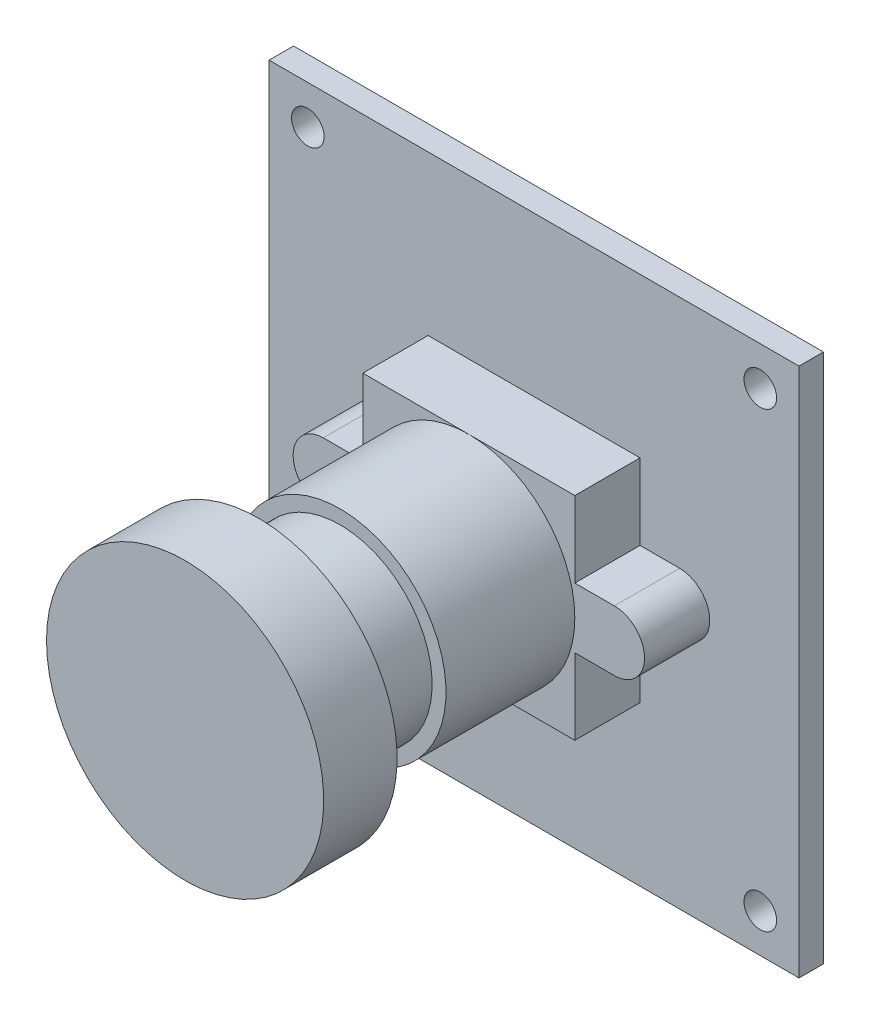
ISO-10303-21;
HEADER;
FILE_DESCRIPTION(('STEP AP214'),'2;1');
FILE_NAME('part.step','',(''),(''),'','','');
FILE_SCHEMA(('AUTOMOTIVE_DESIGN { 1 0 10303 214 1 1 1 1 }'));
ENDSEC;
DATA;
#1=APPLICATION_CONTEXT('core data for automotive mechanical design processes');
#2=APPLICATION_PROTOCOL_DEFINITION('international standard','automotive_design',2000,#1);
#3=PRODUCT_CONTEXT('',#1,'mechanical');
#4=PRODUCT('Part','Part','',(#3));
#5=PRODUCT_RELATED_PRODUCT_CATEGORY('part','',(#4));
#6=PRODUCT_DEFINITION_FORMATION('','',#4);
#7=PRODUCT_DEFINITION_CONTEXT('part definition',#1,'design');
#8=PRODUCT_DEFINITION('design','',#6,#7);
#9=PRODUCT_DEFINITION_SHAPE('','',#8);
#10=(LENGTH_UNIT() NAMED_UNIT(*) SI_UNIT(.MILLI.,.METRE.));
#11=(NAMED_UNIT(*) PLANE_ANGLE_UNIT() SI_UNIT($,.RADIAN.));
#12=(NAMED_UNIT(*) SI_UNIT($,.STERADIAN.) SOLID_ANGLE_UNIT());
#13=UNCERTAINTY_MEASURE_WITH_UNIT(LENGTH_MEASURE(1.E-05),#10,'distance_accuracy_value','');
#14=(GEOMETRIC_REPRESENTATION_CONTEXT(3) GLOBAL_UNCERTAINTY_ASSIGNED_CONTEXT((#13)) GLOBAL_UNIT_ASSIGNED_CONTEXT((#10,
#11,#12)) REPRESENTATION_CONTEXT('',''));
#15=CARTESIAN_POINT('',(0.,0.,0.));
#16=DIRECTION('',(0.,0.,1.));
#17=DIRECTION('',(1.,0.,0.));
#18=AXIS2_PLACEMENT_3D('',#15,#16,#17);
#19=CARTESIAN_POINT('',(0.,0.,0.));
#20=DIRECTION('',(0.,0.,1.));
#21=DIRECTION('',(1.,0.,0.));
#22=AXIS2_PLACEMENT_3D('',#19,#20,#21);
#23=PLANE('',#22);
#24=CARTESIAN_POINT('',(-13.875,13.875,0.));
#25=DIRECTION('',(0.,0.,1.));
#26=DIRECTION('',(1.,0.,0.));
#27=AXIS2_PLACEMENT_3D('',#24,#25,#26);
#28=CIRCLE('',#27,1.);
#29=CARTESIAN_POINT('',(-12.875,13.875,0.));
#30=VERTEX_POINT('',#29);
#31=EDGE_CURVE('E382',#30,#30,#28,.T.);
#32=ORIENTED_EDGE('',*,*,#31,.T.);
#33=EDGE_LOOP('',(#32));
#34=FACE_BOUND('',#33,.T.);
#35=CARTESIAN_POINT('',(-13.875,-13.875,0.));
#36=DIRECTION('',(0.,0.,1.));
#37=DIRECTION('',(1.,0.,0.));
#38=AXIS2_PLACEMENT_3D('',#35,#36,#37);
#39=CIRCLE('',#38,1.);
#40=CARTESIAN_POINT('',(-12.875,-13.875,0.));
#41=VERTEX_POINT('',#40);
#42=EDGE_CURVE('E387',#41,#41,#39,.T.);
#43=ORIENTED_EDGE('',*,*,#42,.T.);
#44=EDGE_LOOP('',(#43));
#45=FACE_BOUND('',#44,.T.);
#46=CARTESIAN_POINT('',(13.875,-13.875,0.));
#47=DIRECTION('',(0.,0.,1.));
#48=DIRECTION('',(1.,0.,0.));
#49=AXIS2_PLACEMENT_3D('',#46,#47,#48);
#50=CIRCLE('',#49,1.);
#51=CARTESIAN_POINT('',(14.875,-13.875,0.));
#52=VERTEX_POINT('',#51);
#53=EDGE_CURVE('E395',#52,#52,#50,.T.);
#54=ORIENTED_EDGE('',*,*,#53,.T.);
#55=EDGE_LOOP('',(#54));
#56=FACE_BOUND('',#55,.T.);
#57=CARTESIAN_POINT('',(13.875,13.875,0.));
#58=DIRECTION('',(0.,0.,1.));
#59=DIRECTION('',(1.,0.,0.));
#60=AXIS2_PLACEMENT_3D('',#57,#58,#59);
#61=CIRCLE('',#60,1.);
#62=CARTESIAN_POINT('',(14.875,13.875,0.));
#63=VERTEX_POINT('',#62);
#64=EDGE_CURVE('E403',#63,#63,#61,.T.);
#65=ORIENTED_EDGE('',*,*,#64,.T.);
#66=EDGE_LOOP('',(#65));
#67=FACE_BOUND('',#66,.T.);
#68=DIRECTION('',(0.,-1.,0.));
#69=VECTOR('',#68,1.);
#70=CARTESIAN_POINT('',(5.,-16.25,0.));
#71=LINE('',#70,#69);
#72=CARTESIAN_POINT('',(5.,-11.5,0.));
#73=VERTEX_POINT('',#72);
#74=CARTESIAN_POINT('',(5.,-16.25,0.));
#75=VERTEX_POINT('',#74);
#76=EDGE_CURVE('E87',#73,#75,#71,.T.);
#77=ORIENTED_EDGE('',*,*,#76,.F.);
#78=DIRECTION('',(1.,0.,0.));
#79=VECTOR('',#78,1.);
#80=CARTESIAN_POINT('',(-5.,-11.5,0.));
#81=LINE('',#80,#79);
#82=CARTESIAN_POINT('',(-5.,-11.5,0.));
#83=VERTEX_POINT('',#82);
#84=EDGE_CURVE('E235',#83,#73,#81,.T.);
#85=ORIENTED_EDGE('',*,*,#84,.F.);
#86=DIRECTION('',(0.,1.,0.));
#87=VECTOR('',#86,1.);
#88=CARTESIAN_POINT('',(-5.,-16.25,0.));
#89=LINE('',#88,#87);
#90=CARTESIAN_POINT('',(-5.,-16.25,0.));
#91=VERTEX_POINT('',#90);
#92=EDGE_CURVE('E462',#91,#83,#89,.T.);
#93=ORIENTED_EDGE('',*,*,#92,.F.);
#94=DIRECTION('',(1.,0.,0.));
#95=VECTOR('',#94,1.);
#96=CARTESIAN_POINT('',(16.25,-16.25,0.));
#97=LINE('',#96,#95);
#98=CARTESIAN_POINT('',(-16.25,-16.25,0.));
#99=VERTEX_POINT('',#98);
#100=EDGE_CURVE('E433',#99,#91,#97,.T.);
#101=ORIENTED_EDGE('',*,*,#100,.F.);
#102=DIRECTION('',(0.,-1.,0.));
#103=VECTOR('',#102,1.);
#104=CARTESIAN_POINT('',(-16.25,-16.25,0.));
#105=LINE('',#104,#103);
#106=CARTESIAN_POINT('',(-16.25,16.25,0.));
#107=VERTEX_POINT('',#106);
#108=EDGE_CURVE('E411',#107,#99,#105,.T.);
#109=ORIENTED_EDGE('',*,*,#108,.F.);
#110=DIRECTION('',(-1.,0.,0.));
#111=VECTOR('',#110,1.);
#112=CARTESIAN_POINT('',(16.25,16.25,0.));
#113=LINE('',#112,#111);
#114=CARTESIAN_POINT('',(16.25,16.25,0.));
#115=VERTEX_POINT('',#114);
#116=EDGE_CURVE('E420',#115,#107,#113,.T.);
#117=ORIENTED_EDGE('',*,*,#116,.F.);
#118=DIRECTION('',(0.,1.,0.));
#119=VECTOR('',#118,1.);
#120=CARTESIAN_POINT('',(16.25,-16.25,0.));
#121=LINE('',#120,#119);
#122=CARTESIAN_POINT('',(16.25,-16.25,0.));
#123=VERTEX_POINT('',#122);
#124=EDGE_CURVE('E436',#123,#115,#121,.T.);
#125=ORIENTED_EDGE('',*,*,#124,.F.);
#126=EDGE_CURVE('E92',#75,#123,#97,.T.);
#127=ORIENTED_EDGE('',*,*,#126,.F.);
#128=EDGE_LOOP('',(#77,#85,#93,#101,#109,#117,#125,#127));
#129=FACE_BOUND('',#128,.T.);
#130=ADVANCED_FACE('F69',(#34,#45,#56,#67,#129),#23,.F.);
#131=CARTESIAN_POINT('',(0.,0.,5.5));
#132=DIRECTION('',(0.,0.,-1.));
#133=DIRECTION('',(-1.,0.,0.));
#134=AXIS2_PLACEMENT_3D('',#131,#132,#133);
#135=PLANE('',#134);
#136=DIRECTION('',(-1.,0.,0.));
#137=VECTOR('',#136,1.);
#138=CARTESIAN_POINT('',(6.5,6.5,5.5));
#139=LINE('',#138,#137);
#140=CARTESIAN_POINT('',(6.5,6.5,5.5));
#141=VERTEX_POINT('',#140);
#142=CARTESIAN_POINT('',(0.,6.5,5.5));
#143=VERTEX_POINT('',#142);
#144=EDGE_CURVE('E268',#141,#143,#139,.T.);
#145=ORIENTED_EDGE('',*,*,#144,.T.);
#146=CARTESIAN_POINT('',(0.,0.,5.5));
#147=DIRECTION('',(0.,0.,-1.));
#148=DIRECTION('',(-1.,0.,0.));
#149=AXIS2_PLACEMENT_3D('',#146,#147,#148);
#150=CIRCLE('',#149,6.5);
#151=CARTESIAN_POINT('',(0.,-6.5,5.5));
#152=VERTEX_POINT('',#151);
#153=EDGE_CURVE('E80',#143,#152,#150,.T.);
#154=ORIENTED_EDGE('',*,*,#153,.T.);
#155=DIRECTION('',(-1.,0.,0.));
#156=VECTOR('',#155,1.);
#157=CARTESIAN_POINT('',(6.5,-6.5,5.5));
#158=LINE('',#157,#156);
#159=CARTESIAN_POINT('',(6.5,-6.5,5.5));
#160=VERTEX_POINT('',#159);
#161=EDGE_CURVE('E279',#160,#152,#158,.T.);
#162=ORIENTED_EDGE('',*,*,#161,.F.);
#163=DIRECTION('',(0.,1.,0.));
#164=VECTOR('',#163,1.);
#165=CARTESIAN_POINT('',(6.5,-6.5,5.5));
#166=LINE('',#165,#164);
#167=CARTESIAN_POINT('',(6.5,-1.85,5.5));
#168=VERTEX_POINT('',#167);
#169=EDGE_CURVE('E284',#160,#168,#166,.T.);
#170=ORIENTED_EDGE('',*,*,#169,.T.);
#171=DIRECTION('',(-1.,0.,0.));
#172=VECTOR('',#171,1.);
#173=CARTESIAN_POINT('',(8.925,-1.84999999999999,5.5));
#174=LINE('',#173,#172);
#175=CARTESIAN_POINT('',(8.925,-1.84999999999999,5.5));
#176=VERTEX_POINT('',#175);
#177=EDGE_CURVE('E337',#176,#168,#174,.T.);
#178=ORIENTED_EDGE('',*,*,#177,.F.);
#179=CARTESIAN_POINT('',(8.925,0.,5.5));
#180=DIRECTION('',(0.,0.,1.));
#181=DIRECTION('',(1.,0.,0.));
#182=AXIS2_PLACEMENT_3D('',#179,#180,#181);
#183=CIRCLE('',#182,1.85);
#184=CARTESIAN_POINT('',(8.925,1.85000000000001,5.5));
#185=VERTEX_POINT('',#184);
#186=EDGE_CURVE('E322',#176,#185,#183,.T.);
#187=ORIENTED_EDGE('',*,*,#186,.T.);
#188=DIRECTION('',(-1.,0.,0.));
#189=VECTOR('',#188,1.);
#190=CARTESIAN_POINT('',(8.925,1.85000000000001,5.5));
#191=LINE('',#190,#189);
#192=CARTESIAN_POINT('',(6.5,1.85,5.5));
#193=VERTEX_POINT('',#192);
#194=EDGE_CURVE('E328',#185,#193,#191,.T.);
#195=ORIENTED_EDGE('',*,*,#194,.T.);
#196=EDGE_CURVE('E283',#193,#141,#166,.T.);
#197=ORIENTED_EDGE('',*,*,#196,.T.);
#198=EDGE_LOOP('',(#145,#154,#162,#170,#178,#187,#195,#197));
#199=FACE_BOUND('',#198,.T.);
#200=ADVANCED_FACE('F493',(#199),#135,.F.);
#201=CARTESIAN_POINT('',(0.,0.,1.5));
#202=DIRECTION('',(0.,0.,1.));
#203=DIRECTION('',(1.,0.,0.));
#204=AXIS2_PLACEMENT_3D('',#201,#202,#203);
#205=PLANE('',#204);
#206=DIRECTION('',(-1.,0.,0.));
#207=VECTOR('',#206,1.);
#208=CARTESIAN_POINT('',(8.925,-1.84999999999999,1.5));
#209=LINE('',#208,#207);
#210=CARTESIAN_POINT('',(8.925,-1.85,1.5));
#211=VERTEX_POINT('',#210);
#212=CARTESIAN_POINT('',(6.5,-1.85,1.5));
#213=VERTEX_POINT('',#212);
#214=EDGE_CURVE('E327',#211,#213,#209,.T.);
#215=ORIENTED_EDGE('',*,*,#214,.T.);
#216=DIRECTION('',(0.,1.,0.));
#217=VECTOR('',#216,1.);
#218=CARTESIAN_POINT('',(6.5,-6.5,1.5));
#219=LINE('',#218,#217);
#220=CARTESIAN_POINT('',(6.5,-6.5,1.5));
#221=VERTEX_POINT('',#220);
#222=EDGE_CURVE('E302',#221,#213,#219,.T.);
#223=ORIENTED_EDGE('',*,*,#222,.F.);
#224=DIRECTION('',(-1.,0.,0.));
#225=VECTOR('',#224,1.);
#226=CARTESIAN_POINT('',(6.5,-6.5,1.5));
#227=LINE('',#226,#225);
#228=CARTESIAN_POINT('',(-6.5,-6.5,1.5));
#229=VERTEX_POINT('',#228);
#230=EDGE_CURVE('E298',#221,#229,#227,.T.);
#231=ORIENTED_EDGE('',*,*,#230,.T.);
#232=DIRECTION('',(0.,1.,0.));
#233=VECTOR('',#232,1.);
#234=CARTESIAN_POINT('',(-6.5,-6.5,1.5));
#235=LINE('',#234,#233);
#236=CARTESIAN_POINT('',(-6.5,-1.85,1.5));
#237=VERTEX_POINT('',#236);
#238=EDGE_CURVE('E295',#229,#237,#235,.T.);
#239=ORIENTED_EDGE('',*,*,#238,.T.);
#240=CARTESIAN_POINT('',(-8.925,-1.85,1.5));
#241=VERTEX_POINT('',#240);
#242=EDGE_CURVE('E354',#237,#241,#209,.T.);
#243=ORIENTED_EDGE('',*,*,#242,.T.);
#244=CARTESIAN_POINT('',(-8.925,0.,1.5));
#245=DIRECTION('',(0.,0.,1.));
#246=DIRECTION('',(1.,0.,0.));
#247=AXIS2_PLACEMENT_3D('',#244,#245,#246);
#248=CIRCLE('',#247,1.85);
#249=CARTESIAN_POINT('',(-8.925,1.85,1.5));
#250=VERTEX_POINT('',#249);
#251=EDGE_CURVE('E350',#250,#241,#248,.T.);
#252=ORIENTED_EDGE('',*,*,#251,.F.);
#253=DIRECTION('',(-1.,0.,0.));
#254=VECTOR('',#253,1.);
#255=CARTESIAN_POINT('',(8.925,1.85000000000001,1.5));
#256=LINE('',#255,#254);
#257=CARTESIAN_POINT('',(-6.5,1.85,1.5));
#258=VERTEX_POINT('',#257);
#259=EDGE_CURVE('E345',#258,#250,#256,.T.);
#260=ORIENTED_EDGE('',*,*,#259,.F.);
#261=CARTESIAN_POINT('',(-6.5,6.5,1.5));
#262=VERTEX_POINT('',#261);
#263=EDGE_CURVE('E293',#258,#262,#235,.T.);
#264=ORIENTED_EDGE('',*,*,#263,.T.);
#265=DIRECTION('',(-1.,0.,0.));
#266=VECTOR('',#265,1.);
#267=CARTESIAN_POINT('',(6.5,6.5,1.5));
#268=LINE('',#267,#266);
#269=CARTESIAN_POINT('',(6.5,6.5,1.5));
#270=VERTEX_POINT('',#269);
#271=EDGE_CURVE('E289',#270,#262,#268,.T.);
#272=ORIENTED_EDGE('',*,*,#271,.F.);
#273=CARTESIAN_POINT('',(6.5,1.85,1.5));
#274=VERTEX_POINT('',#273);
#275=EDGE_CURVE('E301',#274,#270,#219,.T.);
#276=ORIENTED_EDGE('',*,*,#275,.F.);
#277=CARTESIAN_POINT('',(8.925,1.85000000000001,1.5));
#278=VERTEX_POINT('',#277);
#279=EDGE_CURVE('E346',#278,#274,#256,.T.);
#280=ORIENTED_EDGE('',*,*,#279,.F.);
#281=CARTESIAN_POINT('',(8.925,0.,1.5));
#282=DIRECTION('',(0.,0.,1.));
#283=DIRECTION('',(1.,0.,0.));
#284=AXIS2_PLACEMENT_3D('',#281,#282,#283);
#285=CIRCLE('',#284,1.85);
#286=EDGE_CURVE('E267',#211,#278,#285,.T.);
#287=ORIENTED_EDGE('',*,*,#286,.F.);
#288=EDGE_LOOP('',(#215,#223,#231,#239,#243,#252,#260,#264,#272,#276,#280,#287));
#289=FACE_BOUND('',#288,.T.);
#290=CARTESIAN_POINT('',(-13.875,-13.875,1.5));
#291=DIRECTION('',(0.,0.,1.));
#292=DIRECTION('',(1.,0.,0.));
#293=AXIS2_PLACEMENT_3D('',#290,#291,#292);
#294=CIRCLE('',#293,1.);
#295=CARTESIAN_POINT('',(-12.875,-13.875,1.5));
#296=VERTEX_POINT('',#295);
#297=EDGE_CURVE('E391',#296,#296,#294,.T.);
#298=ORIENTED_EDGE('',*,*,#297,.F.);
#299=EDGE_LOOP('',(#298));
#300=FACE_BOUND('',#299,.T.);
#301=CARTESIAN_POINT('',(13.875,13.875,1.5));
#302=DIRECTION('',(0.,0.,1.));
#303=DIRECTION('',(1.,0.,0.));
#304=AXIS2_PLACEMENT_3D('',#301,#302,#303);
#305=CIRCLE('',#304,1.);
#306=CARTESIAN_POINT('',(14.875,13.875,1.5));
#307=VERTEX_POINT('',#306);
#308=EDGE_CURVE('E407',#307,#307,#305,.T.);
#309=ORIENTED_EDGE('',*,*,#308,.F.);
#310=EDGE_LOOP('',(#309));
#311=FACE_BOUND('',#310,.T.);
#312=DIRECTION('',(0.,-1.,0.));
#313=VECTOR('',#312,1.);
#314=CARTESIAN_POINT('',(-16.25,-16.25,1.5));
#315=LINE('',#314,#313);
#316=CARTESIAN_POINT('',(-16.25,16.25,1.5));
#317=VERTEX_POINT('',#316);
#318=CARTESIAN_POINT('',(-16.25,-16.25,1.5));
#319=VERTEX_POINT('',#318);
#320=EDGE_CURVE('E415',#317,#319,#315,.T.);
#321=ORIENTED_EDGE('',*,*,#320,.T.);
#322=DIRECTION('',(1.,0.,0.));
#323=VECTOR('',#322,1.);
#324=CARTESIAN_POINT('',(16.25,-16.25,1.5));
#325=LINE('',#324,#323);
#326=CARTESIAN_POINT('',(16.25,-16.25,1.5));
#327=VERTEX_POINT('',#326);
#328=EDGE_CURVE('E419',#319,#327,#325,.T.);
#329=ORIENTED_EDGE('',*,*,#328,.T.);
#330=DIRECTION('',(0.,1.,0.));
#331=VECTOR('',#330,1.);
#332=CARTESIAN_POINT('',(16.25,-16.25,1.5));
#333=LINE('',#332,#331);
#334=CARTESIAN_POINT('',(16.25,16.25,1.5));
#335=VERTEX_POINT('',#334);
#336=EDGE_CURVE('E423',#327,#335,#333,.T.);
#337=ORIENTED_EDGE('',*,*,#336,.T.);
#338=DIRECTION('',(-1.,0.,0.));
#339=VECTOR('',#338,1.);
#340=CARTESIAN_POINT('',(16.25,16.25,1.5));
#341=LINE('',#340,#339);
#342=EDGE_CURVE('E426',#335,#317,#341,.T.);
#343=ORIENTED_EDGE('',*,*,#342,.T.);
#344=EDGE_LOOP('',(#321,#329,#337,#343));
#345=FACE_BOUND('',#344,.T.);
#346=CARTESIAN_POINT('',(13.875,-13.875,1.5));
#347=DIRECTION('',(0.,0.,1.));
#348=DIRECTION('',(1.,0.,0.));
#349=AXIS2_PLACEMENT_3D('',#346,#347,#348);
#350=CIRCLE('',#349,1.);
#351=CARTESIAN_POINT('',(14.875,-13.875,1.5));
#352=VERTEX_POINT('',#351);
#353=EDGE_CURVE('E399',#352,#352,#350,.T.);
#354=ORIENTED_EDGE('',*,*,#353,.F.);
#355=EDGE_LOOP('',(#354));
#356=FACE_BOUND('',#355,.T.);
#357=CARTESIAN_POINT('',(-13.875,13.875,1.5));
#358=DIRECTION('',(0.,0.,1.));
#359=DIRECTION('',(1.,0.,0.));
#360=AXIS2_PLACEMENT_3D('',#357,#358,#359);
#361=CIRCLE('',#360,1.);
#362=CARTESIAN_POINT('',(-12.875,13.875,1.5));
#363=VERTEX_POINT('',#362);
#364=EDGE_CURVE('E383',#363,#363,#361,.T.);
#365=ORIENTED_EDGE('',*,*,#364,.F.);
#366=EDGE_LOOP('',(#365));
#367=FACE_BOUND('',#366,.T.);
#368=ADVANCED_FACE('F501',(#289,#300,#311,#345,#356,#367),#205,.T.);
#369=CARTESIAN_POINT('',(-16.25,-16.25,1.5));
#370=DIRECTION('',(1.,0.,0.));
#371=DIRECTION('',(0.,0.,-1.));
#372=AXIS2_PLACEMENT_3D('',#369,#370,#371);
#373=PLANE('',#372);
#374=ORIENTED_EDGE('',*,*,#108,.T.);
#375=DIRECTION('',(0.,0.,-1.));
#376=VECTOR('',#375,1.);
#377=CARTESIAN_POINT('',(-16.25,-16.25,1.5));
#378=LINE('',#377,#376);
#379=EDGE_CURVE('E73',#319,#99,#378,.T.);
#380=ORIENTED_EDGE('',*,*,#379,.F.);
#381=ORIENTED_EDGE('',*,*,#320,.F.);
#382=DIRECTION('',(0.,0.,-1.));
#383=VECTOR('',#382,1.);
#384=CARTESIAN_POINT('',(-16.25,16.25,1.5));
#385=LINE('',#384,#383);
#386=EDGE_CURVE('E429',#317,#107,#385,.T.);
#387=ORIENTED_EDGE('',*,*,#386,.T.);
#388=EDGE_LOOP('',(#374,#380,#381,#387));
#389=FACE_BOUND('',#388,.T.);
#390=ADVANCED_FACE('F71',(#389),#373,.F.);
#391=CARTESIAN_POINT('',(16.25,-16.25,1.5));
#392=DIRECTION('',(0.,1.,0.));
#393=DIRECTION('',(-1.,0.,0.));
#394=AXIS2_PLACEMENT_3D('',#391,#392,#393);
#395=PLANE('',#394);
#396=ORIENTED_EDGE('',*,*,#100,.T.);
#397=DIRECTION('',(0.,0.,1.));
#398=VECTOR('',#397,1.);
#399=CARTESIAN_POINT('',(-5.,-16.25,-6.));
#400=LINE('',#399,#398);
#401=CARTESIAN_POINT('',(-5.,-16.25,-6.));
#402=VERTEX_POINT('',#401);
#403=EDGE_CURVE('E220',#402,#91,#400,.T.);
#404=ORIENTED_EDGE('',*,*,#403,.F.);
#405=DIRECTION('',(-1.,0.,0.));
#406=VECTOR('',#405,1.);
#407=CARTESIAN_POINT('',(-5.,-16.25,-6.));
#408=LINE('',#407,#406);
#409=CARTESIAN_POINT('',(5.,-16.25,-6.));
#410=VERTEX_POINT('',#409);
#411=EDGE_CURVE('E213',#410,#402,#408,.T.);
#412=ORIENTED_EDGE('',*,*,#411,.F.);
#413=DIRECTION('',(0.,0.,1.));
#414=VECTOR('',#413,1.);
#415=CARTESIAN_POINT('',(5.,-16.25,-6.));
#416=LINE('',#415,#414);
#417=EDGE_CURVE('E218',#410,#75,#416,.T.);
#418=ORIENTED_EDGE('',*,*,#417,.T.);
#419=ORIENTED_EDGE('',*,*,#126,.T.);
#420=DIRECTION('',(0.,0.,-1.));
#421=VECTOR('',#420,1.);
#422=CARTESIAN_POINT('',(16.25,-16.25,1.5));
#423=LINE('',#422,#421);
#424=EDGE_CURVE('E447',#327,#123,#423,.T.);
#425=ORIENTED_EDGE('',*,*,#424,.F.);
#426=ORIENTED_EDGE('',*,*,#328,.F.);
#427=ORIENTED_EDGE('',*,*,#379,.T.);
#428=EDGE_LOOP('',(#396,#404,#412,#418,#419,#425,#426,#427));
#429=FACE_BOUND('',#428,.T.);
#430=ADVANCED_FACE('F216',(#429),#395,.F.);
#431=CARTESIAN_POINT('',(16.25,-16.25,1.5));
#432=DIRECTION('',(-1.,0.,0.));
#433=DIRECTION('',(0.,0.,1.));
#434=AXIS2_PLACEMENT_3D('',#431,#432,#433);
#435=PLANE('',#434);
#436=ORIENTED_EDGE('',*,*,#124,.T.);
#437=DIRECTION('',(0.,0.,-1.));
#438=VECTOR('',#437,1.);
#439=CARTESIAN_POINT('',(16.25,16.25,1.5));
#440=LINE('',#439,#438);
#441=EDGE_CURVE('E444',#335,#115,#440,.T.);
#442=ORIENTED_EDGE('',*,*,#441,.F.);
#443=ORIENTED_EDGE('',*,*,#336,.F.);
#444=ORIENTED_EDGE('',*,*,#424,.T.);
#445=EDGE_LOOP('',(#436,#442,#443,#444));
#446=FACE_BOUND('',#445,.T.);
#447=ADVANCED_FACE('F513',(#446),#435,.F.);
#448=CARTESIAN_POINT('',(16.25,16.25,1.5));
#449=DIRECTION('',(0.,-1.,0.));
#450=DIRECTION('',(1.,0.,0.));
#451=AXIS2_PLACEMENT_3D('',#448,#449,#450);
#452=PLANE('',#451);
#453=ORIENTED_EDGE('',*,*,#116,.T.);
#454=ORIENTED_EDGE('',*,*,#386,.F.);
#455=ORIENTED_EDGE('',*,*,#342,.F.);
#456=ORIENTED_EDGE('',*,*,#441,.T.);
#457=EDGE_LOOP('',(#453,#454,#455,#456));
#458=FACE_BOUND('',#457,.T.);
#459=ADVANCED_FACE('F509',(#458),#452,.F.);
#460=CARTESIAN_POINT('',(13.875,13.875,1.5));
#461=DIRECTION('',(0.,0.,-1.));
#462=DIRECTION('',(-1.,0.,0.));
#463=AXIS2_PLACEMENT_3D('',#460,#461,#462);
#464=CYLINDRICAL_SURFACE('',#463,1.);
#465=ORIENTED_EDGE('',*,*,#308,.T.);
#466=EDGE_LOOP('',(#465));
#467=FACE_BOUND('',#466,.T.);
#468=ORIENTED_EDGE('',*,*,#64,.F.);
#469=EDGE_LOOP('',(#468));
#470=FACE_BOUND('',#469,.T.);
#471=ADVANCED_FACE('F512',(#467,#470),#464,.F.);
#472=CARTESIAN_POINT('',(13.875,-13.875,1.5));
#473=DIRECTION('',(0.,0.,-1.));
#474=DIRECTION('',(-1.,0.,0.));
#475=AXIS2_PLACEMENT_3D('',#472,#473,#474);
#476=CYLINDRICAL_SURFACE('',#475,1.);
#477=ORIENTED_EDGE('',*,*,#353,.T.);
#478=EDGE_LOOP('',(#477));
#479=FACE_BOUND('',#478,.T.);
#480=ORIENTED_EDGE('',*,*,#53,.F.);
#481=EDGE_LOOP('',(#480));
#482=FACE_BOUND('',#481,.T.);
#483=ADVANCED_FACE('F552',(#479,#482),#476,.F.);
#484=CARTESIAN_POINT('',(-13.875,-13.875,1.5));
#485=DIRECTION('',(0.,0.,-1.));
#486=DIRECTION('',(-1.,0.,0.));
#487=AXIS2_PLACEMENT_3D('',#484,#485,#486);
#488=CYLINDRICAL_SURFACE('',#487,1.);
#489=ORIENTED_EDGE('',*,*,#297,.T.);
#490=EDGE_LOOP('',(#489));
#491=FACE_BOUND('',#490,.T.);
#492=ORIENTED_EDGE('',*,*,#42,.F.);
#493=EDGE_LOOP('',(#492));
#494=FACE_BOUND('',#493,.T.);
#495=ADVANCED_FACE('F542',(#491,#494),#488,.F.);
#496=CARTESIAN_POINT('',(-13.875,13.875,1.5));
#497=DIRECTION('',(0.,0.,-1.));
#498=DIRECTION('',(-1.,0.,0.));
#499=AXIS2_PLACEMENT_3D('',#496,#497,#498);
#500=CYLINDRICAL_SURFACE('',#499,1.);
#501=ORIENTED_EDGE('',*,*,#364,.T.);
#502=EDGE_LOOP('',(#501));
#503=FACE_BOUND('',#502,.T.);
#504=ORIENTED_EDGE('',*,*,#31,.F.);
#505=EDGE_LOOP('',(#504));
#506=FACE_BOUND('',#505,.T.);
#507=ADVANCED_FACE('F539',(#503,#506),#500,.F.);
#508=CARTESIAN_POINT('',(-6.5,-6.5,5.5));
#509=DIRECTION('',(-1.,0.,0.));
#510=DIRECTION('',(0.,0.,1.));
#511=AXIS2_PLACEMENT_3D('',#508,#509,#510);
#512=PLANE('',#511);
#513=DIRECTION('',(0.,0.,1.));
#514=VECTOR('',#513,1.);
#515=CARTESIAN_POINT('',(-6.5,-1.85,5.5));
#516=LINE('',#515,#514);
#517=CARTESIAN_POINT('',(-6.5,-1.85,5.5));
#518=VERTEX_POINT('',#517);
#519=EDGE_CURVE('E374',#237,#518,#516,.T.);
#520=ORIENTED_EDGE('',*,*,#519,.F.);
#521=ORIENTED_EDGE('',*,*,#238,.F.);
#522=DIRECTION('',(0.,0.,-1.));
#523=VECTOR('',#522,1.);
#524=CARTESIAN_POINT('',(-6.5,-6.5,5.5));
#525=LINE('',#524,#523);
#526=CARTESIAN_POINT('',(-6.5,-6.5,5.5));
#527=VERTEX_POINT('',#526);
#528=EDGE_CURVE('E313',#527,#229,#525,.T.);
#529=ORIENTED_EDGE('',*,*,#528,.F.);
#530=DIRECTION('',(0.,1.,0.));
#531=VECTOR('',#530,1.);
#532=CARTESIAN_POINT('',(-6.5,-6.5,5.5));
#533=LINE('',#532,#531);
#534=EDGE_CURVE('E274',#527,#518,#533,.T.);
#535=ORIENTED_EDGE('',*,*,#534,.T.);
#536=EDGE_LOOP('',(#520,#521,#529,#535));
#537=FACE_BOUND('',#536,.T.);
#538=ADVANCED_FACE('F541',(#537),#512,.T.);
#539=CARTESIAN_POINT('',(6.5,-6.5,5.5));
#540=DIRECTION('',(0.,-1.,0.));
#541=DIRECTION('',(1.,0.,0.));
#542=AXIS2_PLACEMENT_3D('',#539,#540,#541);
#543=PLANE('',#542);
#544=ORIENTED_EDGE('',*,*,#230,.F.);
#545=DIRECTION('',(0.,0.,-1.));
#546=VECTOR('',#545,1.);
#547=CARTESIAN_POINT('',(6.5,-6.5,5.5));
#548=LINE('',#547,#546);
#549=EDGE_CURVE('E309',#160,#221,#548,.T.);
#550=ORIENTED_EDGE('',*,*,#549,.F.);
#551=ORIENTED_EDGE('',*,*,#161,.T.);
#552=EDGE_CURVE('E278',#152,#527,#158,.T.);
#553=ORIENTED_EDGE('',*,*,#552,.T.);
#554=ORIENTED_EDGE('',*,*,#528,.T.);
#555=EDGE_LOOP('',(#544,#550,#551,#553,#554));
#556=FACE_BOUND('',#555,.T.);
#557=ADVANCED_FACE('F548',(#556),#543,.T.);
#558=CARTESIAN_POINT('',(6.5,-6.5,5.5));
#559=DIRECTION('',(-1.,0.,0.));
#560=DIRECTION('',(0.,0.,1.));
#561=AXIS2_PLACEMENT_3D('',#558,#559,#560);
#562=PLANE('',#561);
#563=ORIENTED_EDGE('',*,*,#222,.T.);
#564=DIRECTION('',(0.,0.,1.));
#565=VECTOR('',#564,1.);
#566=CARTESIAN_POINT('',(6.5,-1.85,5.5));
#567=LINE('',#566,#565);
#568=EDGE_CURVE('E321',#213,#168,#567,.T.);
#569=ORIENTED_EDGE('',*,*,#568,.T.);
#570=ORIENTED_EDGE('',*,*,#169,.F.);
#571=ORIENTED_EDGE('',*,*,#549,.T.);
#572=EDGE_LOOP('',(#563,#569,#570,#571));
#573=FACE_BOUND('',#572,.T.);
#574=ADVANCED_FACE('F601',(#573),#562,.F.);
#575=ORIENTED_EDGE('',*,*,#552,.F.);
#576=EDGE_CURVE('E12',#152,#143,#150,.T.);
#577=ORIENTED_EDGE('',*,*,#576,.T.);
#578=CARTESIAN_POINT('',(-6.5,6.5,5.5));
#579=VERTEX_POINT('',#578);
#580=EDGE_CURVE('E273',#143,#579,#139,.T.);
#581=ORIENTED_EDGE('',*,*,#580,.T.);
#582=CARTESIAN_POINT('',(-6.5,1.85,5.5));
#583=VERTEX_POINT('',#582);
#584=EDGE_CURVE('E272',#583,#579,#533,.T.);
#585=ORIENTED_EDGE('',*,*,#584,.F.);
#586=CARTESIAN_POINT('',(-8.925,1.85,5.5));
#587=VERTEX_POINT('',#586);
#588=EDGE_CURVE('E326',#583,#587,#191,.T.);
#589=ORIENTED_EDGE('',*,*,#588,.T.);
#590=CARTESIAN_POINT('',(-8.925,0.,5.5));
#591=DIRECTION('',(0.,0.,1.));
#592=DIRECTION('',(1.,0.,0.));
#593=AXIS2_PLACEMENT_3D('',#590,#591,#592);
#594=CIRCLE('',#593,1.85);
#595=CARTESIAN_POINT('',(-8.925,-1.85,5.5));
#596=VERTEX_POINT('',#595);
#597=EDGE_CURVE('E332',#587,#596,#594,.T.);
#598=ORIENTED_EDGE('',*,*,#597,.T.);
#599=EDGE_CURVE('E336',#518,#596,#174,.T.);
#600=ORIENTED_EDGE('',*,*,#599,.F.);
#601=ORIENTED_EDGE('',*,*,#534,.F.);
#602=EDGE_LOOP('',(#575,#577,#581,#585,#589,#598,#600,#601));
#603=FACE_BOUND('',#602,.T.);
#604=ADVANCED_FACE('F504',(#603),#135,.F.);
#605=CARTESIAN_POINT('',(6.5,6.5,5.5));
#606=DIRECTION('',(0.,-1.,0.));
#607=DIRECTION('',(1.,0.,0.));
#608=AXIS2_PLACEMENT_3D('',#605,#606,#607);
#609=PLANE('',#608);
#610=ORIENTED_EDGE('',*,*,#271,.T.);
#611=DIRECTION('',(0.,0.,-1.));
#612=VECTOR('',#611,1.);
#613=CARTESIAN_POINT('',(-6.5,6.5,5.5));
#614=LINE('',#613,#612);
#615=EDGE_CURVE('E317',#579,#262,#614,.T.);
#616=ORIENTED_EDGE('',*,*,#615,.F.);
#617=ORIENTED_EDGE('',*,*,#580,.F.);
#618=ORIENTED_EDGE('',*,*,#144,.F.);
#619=DIRECTION('',(0.,0.,-1.));
#620=VECTOR('',#619,1.);
#621=CARTESIAN_POINT('',(6.5,6.5,5.5));
#622=LINE('',#621,#620);
#623=EDGE_CURVE('E288',#141,#270,#622,.T.);
#624=ORIENTED_EDGE('',*,*,#623,.T.);
#625=EDGE_LOOP('',(#610,#616,#617,#618,#624));
#626=FACE_BOUND('',#625,.T.);
#627=ADVANCED_FACE('F621',(#626),#609,.F.);
#628=ORIENTED_EDGE('',*,*,#263,.F.);
#629=DIRECTION('',(0.,0.,1.));
#630=VECTOR('',#629,1.);
#631=CARTESIAN_POINT('',(-6.5,1.85,5.5));
#632=LINE('',#631,#630);
#633=EDGE_CURVE('E377',#258,#583,#632,.T.);
#634=ORIENTED_EDGE('',*,*,#633,.T.);
#635=ORIENTED_EDGE('',*,*,#584,.T.);
#636=ORIENTED_EDGE('',*,*,#615,.T.);
#637=EDGE_LOOP('',(#628,#634,#635,#636));
#638=FACE_BOUND('',#637,.T.);
#639=ADVANCED_FACE('F551',(#638),#512,.T.);
#640=DIRECTION('',(0.,0.,1.));
#641=VECTOR('',#640,1.);
#642=CARTESIAN_POINT('',(6.5,1.85000000000001,5.5));
#643=LINE('',#642,#641);
#644=EDGE_CURVE('E373',#274,#193,#643,.T.);
#645=ORIENTED_EDGE('',*,*,#644,.F.);
#646=ORIENTED_EDGE('',*,*,#275,.T.);
#647=ORIENTED_EDGE('',*,*,#623,.F.);
#648=ORIENTED_EDGE('',*,*,#196,.F.);
#649=EDGE_LOOP('',(#645,#646,#647,#648));
#650=FACE_BOUND('',#649,.T.);
#651=ADVANCED_FACE('F613',(#650),#562,.F.);
#652=CARTESIAN_POINT('',(8.925,0.,5.5));
#653=DIRECTION('',(0.,0.,-1.));
#654=DIRECTION('',(-1.,0.,0.));
#655=AXIS2_PLACEMENT_3D('',#652,#653,#654);
#656=CYLINDRICAL_SURFACE('',#655,1.85);
#657=ORIENTED_EDGE('',*,*,#286,.T.);
#658=DIRECTION('',(0.,0.,-1.));
#659=VECTOR('',#658,1.);
#660=CARTESIAN_POINT('',(8.925,1.85000000000001,5.5));
#661=LINE('',#660,#659);
#662=EDGE_CURVE('E294',#185,#278,#661,.T.);
#663=ORIENTED_EDGE('',*,*,#662,.F.);
#664=ORIENTED_EDGE('',*,*,#186,.F.);
#665=DIRECTION('',(0.,0.,-1.));
#666=VECTOR('',#665,1.);
#667=CARTESIAN_POINT('',(8.925,-1.84999999999999,5.5));
#668=LINE('',#667,#666);
#669=EDGE_CURVE('E341',#176,#211,#668,.T.);
#670=ORIENTED_EDGE('',*,*,#669,.T.);
#671=EDGE_LOOP('',(#657,#663,#664,#670));
#672=FACE_BOUND('',#671,.T.);
#673=ADVANCED_FACE('F556',(#672),#656,.T.);
#674=CARTESIAN_POINT('',(8.925,1.85000000000001,5.5));
#675=DIRECTION('',(0.,-1.,0.));
#676=DIRECTION('',(1.,0.,0.));
#677=AXIS2_PLACEMENT_3D('',#674,#675,#676);
#678=PLANE('',#677);
#679=ORIENTED_EDGE('',*,*,#279,.T.);
#680=ORIENTED_EDGE('',*,*,#644,.T.);
#681=ORIENTED_EDGE('',*,*,#194,.F.);
#682=ORIENTED_EDGE('',*,*,#662,.T.);
#683=EDGE_LOOP('',(#679,#680,#681,#682));
#684=FACE_BOUND('',#683,.T.);
#685=ADVANCED_FACE('F658',(#684),#678,.F.);
#686=CARTESIAN_POINT('',(8.925,-1.84999999999999,5.5));
#687=DIRECTION('',(0.,-1.,0.));
#688=DIRECTION('',(1.,0.,0.));
#689=AXIS2_PLACEMENT_3D('',#686,#687,#688);
#690=PLANE('',#689);
#691=ORIENTED_EDGE('',*,*,#568,.F.);
#692=ORIENTED_EDGE('',*,*,#214,.F.);
#693=ORIENTED_EDGE('',*,*,#669,.F.);
#694=ORIENTED_EDGE('',*,*,#177,.T.);
#695=EDGE_LOOP('',(#691,#692,#693,#694));
#696=FACE_BOUND('',#695,.T.);
#697=ADVANCED_FACE('F667',(#696),#690,.T.);
#698=ORIENTED_EDGE('',*,*,#633,.F.);
#699=ORIENTED_EDGE('',*,*,#259,.T.);
#700=DIRECTION('',(0.,0.,-1.));
#701=VECTOR('',#700,1.);
#702=CARTESIAN_POINT('',(-8.925,1.85,5.5));
#703=LINE('',#702,#701);
#704=EDGE_CURVE('E364',#587,#250,#703,.T.);
#705=ORIENTED_EDGE('',*,*,#704,.F.);
#706=ORIENTED_EDGE('',*,*,#588,.F.);
#707=EDGE_LOOP('',(#698,#699,#705,#706));
#708=FACE_BOUND('',#707,.T.);
#709=ADVANCED_FACE('F669',(#708),#678,.F.);
#710=CARTESIAN_POINT('',(-8.925,0.,5.5));
#711=DIRECTION('',(0.,0.,-1.));
#712=DIRECTION('',(-1.,0.,0.));
#713=AXIS2_PLACEMENT_3D('',#710,#711,#712);
#714=CYLINDRICAL_SURFACE('',#713,1.85);
#715=ORIENTED_EDGE('',*,*,#251,.T.);
#716=DIRECTION('',(0.,0.,-1.));
#717=VECTOR('',#716,1.);
#718=CARTESIAN_POINT('',(-8.925,-1.85,5.5));
#719=LINE('',#718,#717);
#720=EDGE_CURVE('E360',#596,#241,#719,.T.);
#721=ORIENTED_EDGE('',*,*,#720,.F.);
#722=ORIENTED_EDGE('',*,*,#597,.F.);
#723=ORIENTED_EDGE('',*,*,#704,.T.);
#724=EDGE_LOOP('',(#715,#721,#722,#723));
#725=FACE_BOUND('',#724,.T.);
#726=ADVANCED_FACE('F687',(#725),#714,.T.);
#727=ORIENTED_EDGE('',*,*,#242,.F.);
#728=ORIENTED_EDGE('',*,*,#519,.T.);
#729=ORIENTED_EDGE('',*,*,#599,.T.);
#730=ORIENTED_EDGE('',*,*,#720,.T.);
#731=EDGE_LOOP('',(#727,#728,#729,#730));
#732=FACE_BOUND('',#731,.T.);
#733=ADVANCED_FACE('F679',(#732),#690,.T.);
#734=CARTESIAN_POINT('',(0.,0.,0.));
#735=DIRECTION('',(0.,0.,-1.));
#736=DIRECTION('',(-1.,0.,0.));
#737=AXIS2_PLACEMENT_3D('',#734,#735,#736);
#738=CYLINDRICAL_SURFACE('',#737,6.5);
#739=ORIENTED_EDGE('',*,*,#153,.F.);
#740=ORIENTED_EDGE('',*,*,#576,.F.);
#741=EDGE_LOOP('',(#739,#740));
#742=FACE_BOUND('',#741,.T.);
#743=CARTESIAN_POINT('',(0.,0.,13.4));
#744=DIRECTION('',(0.,0.,-1.));
#745=DIRECTION('',(-1.,0.,0.));
#746=AXIS2_PLACEMENT_3D('',#743,#744,#745);
#747=CIRCLE('',#746,6.5);
#748=CARTESIAN_POINT('',(-6.5,0.,13.4));
#749=VERTEX_POINT('',#748);
#750=EDGE_CURVE('E261',#749,#749,#747,.T.);
#751=ORIENTED_EDGE('',*,*,#750,.T.);
#752=EDGE_LOOP('',(#751));
#753=FACE_BOUND('',#752,.T.);
#754=ADVANCED_FACE('F705',(#742,#753),#738,.T.);
#755=CARTESIAN_POINT('',(6.5,0.,13.4));
#756=DIRECTION('',(0.,0.,-1.));
#757=DIRECTION('',(-1.,0.,0.));
#758=AXIS2_PLACEMENT_3D('',#755,#756,#757);
#759=PLANE('',#758);
#760=ORIENTED_EDGE('',*,*,#750,.F.);
#761=EDGE_LOOP('',(#760));
#762=FACE_BOUND('',#761,.T.);
#763=CARTESIAN_POINT('',(0.,0.,13.4));
#764=DIRECTION('',(0.,0.,-1.));
#765=DIRECTION('',(-1.,0.,0.));
#766=AXIS2_PLACEMENT_3D('',#763,#764,#765);
#767=CIRCLE('',#766,5.65);
#768=CARTESIAN_POINT('',(-5.65,0.,13.4));
#769=VERTEX_POINT('',#768);
#770=EDGE_CURVE('E257',#769,#769,#767,.T.);
#771=ORIENTED_EDGE('',*,*,#770,.T.);
#772=EDGE_LOOP('',(#771));
#773=FACE_BOUND('',#772,.T.);
#774=ADVANCED_FACE('F721',(#762,#773),#759,.F.);
#775=CARTESIAN_POINT('',(0.,0.,0.));
#776=DIRECTION('',(0.,0.,-1.));
#777=DIRECTION('',(-1.,0.,0.));
#778=AXIS2_PLACEMENT_3D('',#775,#776,#777);
#779=CYLINDRICAL_SURFACE('',#778,5.65);
#780=ORIENTED_EDGE('',*,*,#770,.F.);
#781=EDGE_LOOP('',(#780));
#782=FACE_BOUND('',#781,.T.);
#783=CARTESIAN_POINT('',(0.,0.,18.4));
#784=DIRECTION('',(0.,0.,-1.));
#785=DIRECTION('',(-1.,0.,0.));
#786=AXIS2_PLACEMENT_3D('',#783,#784,#785);
#787=CIRCLE('',#786,5.65);
#788=CARTESIAN_POINT('',(-5.65,0.,18.4));
#789=VERTEX_POINT('',#788);
#790=EDGE_CURVE('E253',#789,#789,#787,.T.);
#791=ORIENTED_EDGE('',*,*,#790,.T.);
#792=EDGE_LOOP('',(#791));
#793=FACE_BOUND('',#792,.T.);
#794=ADVANCED_FACE('F731',(#782,#793),#779,.T.);
#795=CARTESIAN_POINT('',(5.65,0.,18.4));
#796=DIRECTION('',(0.,0.,1.));
#797=DIRECTION('',(1.,0.,0.));
#798=AXIS2_PLACEMENT_3D('',#795,#796,#797);
#799=PLANE('',#798);
#800=ORIENTED_EDGE('',*,*,#790,.F.);
#801=EDGE_LOOP('',(#800));
#802=FACE_BOUND('',#801,.T.);
#803=CARTESIAN_POINT('',(0.,0.,18.4));
#804=DIRECTION('',(0.,0.,-1.));
#805=DIRECTION('',(-1.,0.,0.));
#806=AXIS2_PLACEMENT_3D('',#803,#804,#805);
#807=CIRCLE('',#806,8.5);
#808=CARTESIAN_POINT('',(-8.5,0.,18.4));
#809=VERTEX_POINT('',#808);
#810=EDGE_CURVE('E244',#809,#809,#807,.T.);
#811=ORIENTED_EDGE('',*,*,#810,.T.);
#812=EDGE_LOOP('',(#811));
#813=FACE_BOUND('',#812,.T.);
#814=ADVANCED_FACE('F741',(#802,#813),#799,.F.);
#815=CARTESIAN_POINT('',(0.,0.,0.));
#816=DIRECTION('',(0.,0.,-1.));
#817=DIRECTION('',(-1.,0.,0.));
#818=AXIS2_PLACEMENT_3D('',#815,#816,#817);
#819=CYLINDRICAL_SURFACE('',#818,8.5);
#820=ORIENTED_EDGE('',*,*,#810,.F.);
#821=EDGE_LOOP('',(#820));
#822=FACE_BOUND('',#821,.T.);
#823=CARTESIAN_POINT('',(0.,0.,22.9));
#824=DIRECTION('',(0.,0.,-1.));
#825=DIRECTION('',(-1.,0.,0.));
#826=AXIS2_PLACEMENT_3D('',#823,#824,#825);
#827=CIRCLE('',#826,8.50000000000001);
#828=CARTESIAN_POINT('',(-8.50000000000001,0.,22.9));
#829=VERTEX_POINT('',#828);
#830=EDGE_CURVE('E239',#829,#829,#827,.T.);
#831=ORIENTED_EDGE('',*,*,#830,.T.);
#832=EDGE_LOOP('',(#831));
#833=FACE_BOUND('',#832,.T.);
#834=ADVANCED_FACE('F751',(#822,#833),#819,.T.);
#835=CARTESIAN_POINT('',(8.50000000000001,0.,22.9));
#836=DIRECTION('',(0.,0.,-1.));
#837=DIRECTION('',(-1.,0.,0.));
#838=AXIS2_PLACEMENT_3D('',#835,#836,#837);
#839=PLANE('',#838);
#840=ORIENTED_EDGE('',*,*,#830,.F.);
#841=EDGE_LOOP('',(#840));
#842=FACE_BOUND('',#841,.T.);
#843=ADVANCED_FACE('F490',(#842),#839,.F.);
#844=CARTESIAN_POINT('',(5.,-16.25,-6.));
#845=DIRECTION('',(-1.,0.,0.));
#846=DIRECTION('',(0.,0.,1.));
#847=AXIS2_PLACEMENT_3D('',#844,#845,#846);
#848=PLANE('',#847);
#849=ORIENTED_EDGE('',*,*,#76,.T.);
#850=ORIENTED_EDGE('',*,*,#417,.F.);
#851=DIRECTION('',(0.,-1.,0.));
#852=VECTOR('',#851,1.);
#853=CARTESIAN_POINT('',(5.,-16.25,-6.));
#854=LINE('',#853,#852);
#855=CARTESIAN_POINT('',(5.,-11.5,-6.));
#856=VERTEX_POINT('',#855);
#857=EDGE_CURVE('E225',#856,#410,#854,.T.);
#858=ORIENTED_EDGE('',*,*,#857,.F.);
#859=DIRECTION('',(0.,0.,1.));
#860=VECTOR('',#859,1.);
#861=CARTESIAN_POINT('',(5.,-11.5,-6.));
#862=LINE('',#861,#860);
#863=EDGE_CURVE('E474',#856,#73,#862,.T.);
#864=ORIENTED_EDGE('',*,*,#863,.T.);
#865=EDGE_LOOP('',(#849,#850,#858,#864));
#866=FACE_BOUND('',#865,.T.);
#867=ADVANCED_FACE('F237',(#866),#848,.F.);
#868=CARTESIAN_POINT('',(-5.,-16.25,-6.));
#869=DIRECTION('',(1.,0.,0.));
#870=DIRECTION('',(0.,0.,-1.));
#871=AXIS2_PLACEMENT_3D('',#868,#869,#870);
#872=PLANE('',#871);
#873=ORIENTED_EDGE('',*,*,#92,.T.);
#874=DIRECTION('',(0.,0.,1.));
#875=VECTOR('',#874,1.);
#876=CARTESIAN_POINT('',(-5.,-11.5,-6.));
#877=LINE('',#876,#875);
#878=CARTESIAN_POINT('',(-5.,-11.5,-6.));
#879=VERTEX_POINT('',#878);
#880=EDGE_CURVE('E246',#879,#83,#877,.T.);
#881=ORIENTED_EDGE('',*,*,#880,.F.);
#882=DIRECTION('',(0.,1.,0.));
#883=VECTOR('',#882,1.);
#884=CARTESIAN_POINT('',(-5.,-16.25,-6.));
#885=LINE('',#884,#883);
#886=EDGE_CURVE('E224',#402,#879,#885,.T.);
#887=ORIENTED_EDGE('',*,*,#886,.F.);
#888=ORIENTED_EDGE('',*,*,#403,.T.);
#889=EDGE_LOOP('',(#873,#881,#887,#888));
#890=FACE_BOUND('',#889,.T.);
#891=ADVANCED_FACE('F479',(#890),#872,.F.);
#892=CARTESIAN_POINT('',(-5.,-11.5,-6.));
#893=DIRECTION('',(0.,-1.,0.));
#894=DIRECTION('',(1.,0.,0.));
#895=AXIS2_PLACEMENT_3D('',#892,#893,#894);
#896=PLANE('',#895);
#897=ORIENTED_EDGE('',*,*,#84,.T.);
#898=ORIENTED_EDGE('',*,*,#863,.F.);
#899=DIRECTION('',(1.,0.,0.));
#900=VECTOR('',#899,1.);
#901=CARTESIAN_POINT('',(-5.,-11.5,-6.));
#902=LINE('',#901,#900);
#903=EDGE_CURVE('E230',#879,#856,#902,.T.);
#904=ORIENTED_EDGE('',*,*,#903,.F.);
#905=ORIENTED_EDGE('',*,*,#880,.T.);
#906=EDGE_LOOP('',(#897,#898,#904,#905));
#907=FACE_BOUND('',#906,.T.);
#908=ADVANCED_FACE('F478',(#907),#896,.F.);
#909=CARTESIAN_POINT('',(0.,0.,-6.));
#910=DIRECTION('',(0.,0.,-1.));
#911=DIRECTION('',(-1.,0.,0.));
#912=AXIS2_PLACEMENT_3D('',#909,#910,#911);
#913=PLANE('',#912);
#914=ORIENTED_EDGE('',*,*,#857,.T.);
#915=ORIENTED_EDGE('',*,*,#411,.T.);
#916=ORIENTED_EDGE('',*,*,#886,.T.);
#917=ORIENTED_EDGE('',*,*,#903,.T.);
#918=EDGE_LOOP('',(#914,#915,#916,#917));
#919=FACE_BOUND('',#918,.T.);
#920=ADVANCED_FACE('F228',(#919),#913,.T.);
#921=CLOSED_SHELL('',(#130,#200,#368,#390,#430,#447,#459,#471,#483,#495,#507,#538,#557,#574,
#604,#627,#639,#651,#673,#685,#697,#709,#726,#733,#754,#774,#794,#814,#834,#843,#867,#891,#908,#920));
#922=MANIFOLD_SOLID_BREP('B2',#921);
#923=ADVANCED_BREP_SHAPE_REPRESENTATION('',(#18,#922),#14);
#924=SHAPE_DEFINITION_REPRESENTATION(#9,#923);
ENDSEC;
END-ISO-10303-21;
